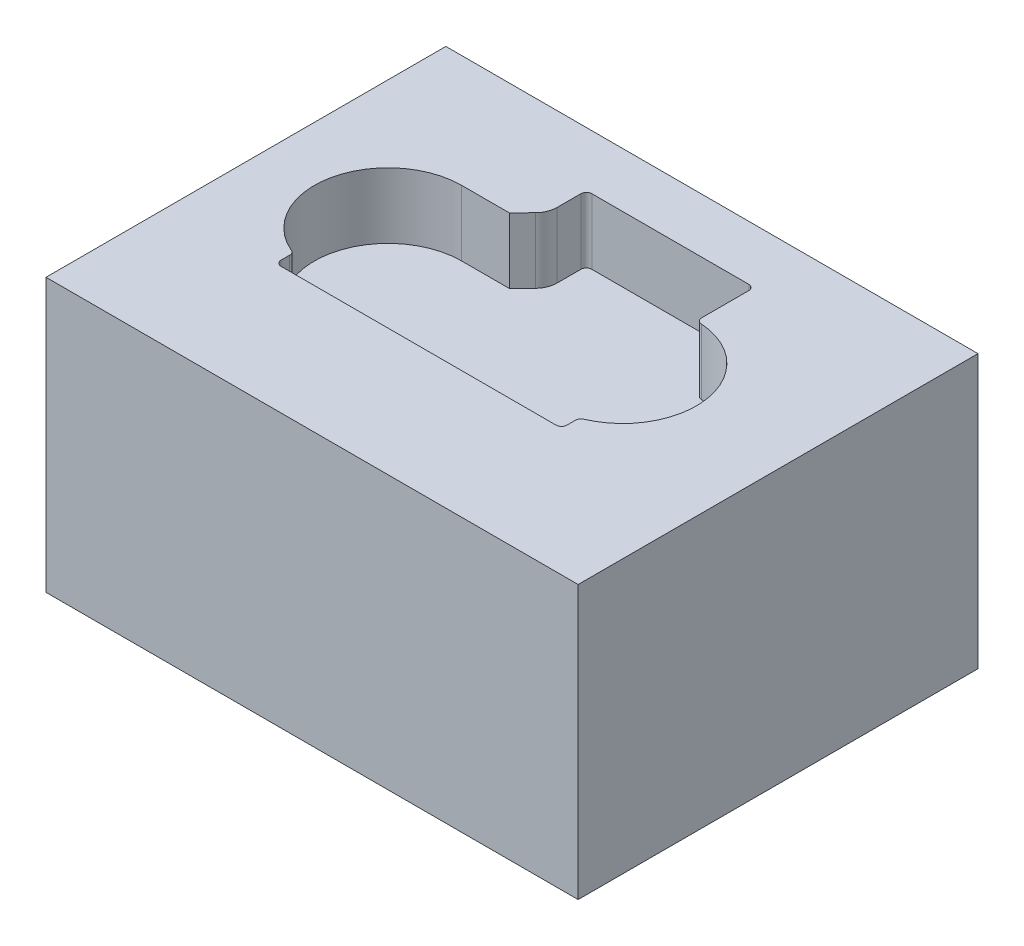
ISO-10303-21;
HEADER;
FILE_DESCRIPTION(('STEP AP214'),'2;1');
FILE_NAME('part.step','',(''),(''),'','','');
FILE_SCHEMA(('AUTOMOTIVE_DESIGN { 1 0 10303 214 1 1 1 1 }'));
ENDSEC;
DATA;
#1=APPLICATION_CONTEXT('core data for automotive mechanical design processes');
#2=APPLICATION_PROTOCOL_DEFINITION('international standard','automotive_design',2000,#1);
#3=PRODUCT_CONTEXT('',#1,'mechanical');
#4=PRODUCT('Part','Part','',(#3));
#5=PRODUCT_RELATED_PRODUCT_CATEGORY('part','',(#4));
#6=PRODUCT_DEFINITION_FORMATION('','',#4);
#7=PRODUCT_DEFINITION_CONTEXT('part definition',#1,'design');
#8=PRODUCT_DEFINITION('design','',#6,#7);
#9=PRODUCT_DEFINITION_SHAPE('','',#8);
#10=(LENGTH_UNIT() NAMED_UNIT(*) SI_UNIT(.MILLI.,.METRE.));
#11=(NAMED_UNIT(*) PLANE_ANGLE_UNIT() SI_UNIT($,.RADIAN.));
#12=(NAMED_UNIT(*) SI_UNIT($,.STERADIAN.) SOLID_ANGLE_UNIT());
#13=UNCERTAINTY_MEASURE_WITH_UNIT(LENGTH_MEASURE(1.E-05),#10,'distance_accuracy_value','');
#14=(GEOMETRIC_REPRESENTATION_CONTEXT(3) GLOBAL_UNCERTAINTY_ASSIGNED_CONTEXT((#13)) GLOBAL_UNIT_ASSIGNED_CONTEXT((#10,
#11,#12)) REPRESENTATION_CONTEXT('',''));
#15=CARTESIAN_POINT('',(0.,0.,0.));
#16=DIRECTION('',(0.,0.,1.));
#17=DIRECTION('',(1.,0.,0.));
#18=AXIS2_PLACEMENT_3D('',#15,#16,#17);
#19=CARTESIAN_POINT('',(0.,25.,0.));
#20=DIRECTION('',(0.,1.,0.));
#21=DIRECTION('',(0.,0.,1.));
#22=AXIS2_PLACEMENT_3D('',#19,#20,#21);
#23=PLANE('',#22);
#24=DIRECTION('',(0.,0.,-1.));
#25=VECTOR('',#24,1.);
#26=CARTESIAN_POINT('',(-101.75,25.,2.66427341404739E-13));
#27=LINE('',#26,#25);
#28=CARTESIAN_POINT('',(-101.75,25.,-180.182738070745));
#29=VERTEX_POINT('',#28);
#30=CARTESIAN_POINT('',(-101.75,25.,-184.5));
#31=VERTEX_POINT('',#30);
#32=EDGE_CURVE('E244',#29,#31,#27,.T.);
#33=ORIENTED_EDGE('',*,*,#32,.F.);
#34=CARTESIAN_POINT('',(-101.25,25.,-180.182738070745));
#35=DIRECTION('',(0.,1.,0.));
#36=DIRECTION('',(0.,0.,1.));
#37=AXIS2_PLACEMENT_3D('',#34,#35,#36);
#38=CIRCLE('',#37,0.5);
#39=CARTESIAN_POINT('',(-101.284482758621,25.,-179.683928548624));
#40=VERTEX_POINT('',#39);
#41=EDGE_CURVE('E308',#29,#40,#38,.T.);
#42=ORIENTED_EDGE('',*,*,#41,.T.);
#43=CARTESIAN_POINT('',(-101.75,25.,-172.95));
#44=DIRECTION('',(0.,1.,0.));
#45=DIRECTION('',(0.,0.,1.));
#46=AXIS2_PLACEMENT_3D('',#43,#44,#45);
#47=CIRCLE('',#46,6.74999999999998);
#48=CARTESIAN_POINT('',(-99.1022841051659,25.,-166.740966215244));
#49=VERTEX_POINT('',#48);
#50=EDGE_CURVE('E214',#40,#49,#47,.F.);
#51=ORIENTED_EDGE('',*,*,#50,.T.);
#52=CARTESIAN_POINT('',(-98.9061570018448,25.,-166.281037786743));
#53=DIRECTION('',(0.,1.,0.));
#54=DIRECTION('',(0.,0.,1.));
#55=AXIS2_PLACEMENT_3D('',#52,#53,#54);
#56=CIRCLE('',#55,0.5);
#57=CARTESIAN_POINT('',(-99.4061570018448,25.,-166.281037786743));
#58=VERTEX_POINT('',#57);
#59=EDGE_CURVE('E298',#49,#58,#56,.T.);
#60=ORIENTED_EDGE('',*,*,#59,.T.);
#61=DIRECTION('',(0.,0.,1.));
#62=VECTOR('',#61,1.);
#63=CARTESIAN_POINT('',(-99.4061570018448,25.,0.));
#64=LINE('',#63,#62);
#65=CARTESIAN_POINT('',(-99.4061570018448,25.,-165.5));
#66=VERTEX_POINT('',#65);
#67=EDGE_CURVE('E218',#58,#66,#64,.T.);
#68=ORIENTED_EDGE('',*,*,#67,.T.);
#69=CARTESIAN_POINT('',(-99.9061570018448,25.,-165.5));
#70=DIRECTION('',(0.,1.,0.));
#71=DIRECTION('',(0.,0.,1.));
#72=AXIS2_PLACEMENT_3D('',#69,#70,#71);
#73=CIRCLE('',#72,0.5);
#74=CARTESIAN_POINT('',(-99.9061570018448,25.,-165.));
#75=VERTEX_POINT('',#74);
#76=EDGE_CURVE('E11',#66,#75,#73,.F.);
#77=ORIENTED_EDGE('',*,*,#76,.T.);
#78=DIRECTION('',(1.,0.,0.));
#79=VECTOR('',#78,1.);
#80=CARTESIAN_POINT('',(0.,25.,-165.));
#81=LINE('',#80,#79);
#82=CARTESIAN_POINT('',(-125.093842998155,25.,-165.));
#83=VERTEX_POINT('',#82);
#84=EDGE_CURVE('E262',#83,#75,#81,.T.);
#85=ORIENTED_EDGE('',*,*,#84,.F.);
#86=CARTESIAN_POINT('',(-125.093842998155,25.,-165.5));
#87=DIRECTION('',(0.,1.,0.));
#88=DIRECTION('',(0.,0.,1.));
#89=AXIS2_PLACEMENT_3D('',#86,#87,#88);
#90=CIRCLE('',#89,0.5);
#91=CARTESIAN_POINT('',(-125.593842998155,25.,-165.5));
#92=VERTEX_POINT('',#91);
#93=EDGE_CURVE('E41',#83,#92,#90,.F.);
#94=ORIENTED_EDGE('',*,*,#93,.T.);
#95=DIRECTION('',(0.,0.,1.));
#96=VECTOR('',#95,1.);
#97=CARTESIAN_POINT('',(-125.593842998155,25.,0.));
#98=LINE('',#97,#96);
#99=CARTESIAN_POINT('',(-125.593842998155,25.,-166.281037786743));
#100=VERTEX_POINT('',#99);
#101=EDGE_CURVE('E259',#100,#92,#98,.T.);
#102=ORIENTED_EDGE('',*,*,#101,.F.);
#103=CARTESIAN_POINT('',(-126.093842998155,25.,-166.281037786743));
#104=DIRECTION('',(0.,1.,0.));
#105=DIRECTION('',(0.,0.,1.));
#106=AXIS2_PLACEMENT_3D('',#103,#104,#105);
#107=CIRCLE('',#106,0.5);
#108=CARTESIAN_POINT('',(-125.897715894834,25.,-166.740966215244));
#109=VERTEX_POINT('',#108);
#110=EDGE_CURVE('E289',#100,#109,#107,.T.);
#111=ORIENTED_EDGE('',*,*,#110,.T.);
#112=CARTESIAN_POINT('',(-123.25,25.,-172.95));
#113=DIRECTION('',(0.,1.,0.));
#114=DIRECTION('',(0.,0.,1.));
#115=AXIS2_PLACEMENT_3D('',#112,#113,#114);
#116=CIRCLE('',#115,6.74999999999999);
#117=CARTESIAN_POINT('',(-123.25,25.,-179.7));
#118=VERTEX_POINT('',#117);
#119=EDGE_CURVE('E256',#118,#109,#116,.T.);
#120=ORIENTED_EDGE('',*,*,#119,.F.);
#121=DIRECTION('',(1.,0.,0.));
#122=VECTOR('',#121,1.);
#123=CARTESIAN_POINT('',(-2.28233147419287E-12,25.,-179.700000000001));
#124=LINE('',#123,#122);
#125=CARTESIAN_POINT('',(-118.879314151318,25.,-179.7));
#126=VERTEX_POINT('',#125);
#127=EDGE_CURVE('E253',#118,#126,#124,.T.);
#128=ORIENTED_EDGE('',*,*,#127,.T.);
#129=DIRECTION('',(-0.696937908891496,0.,0.717131474103562));
#130=VECTOR('',#129,1.);
#131=CARTESIAN_POINT('',(-150.950323524299,25.,-146.699742826135));
#132=LINE('',#131,#130);
#133=CARTESIAN_POINT('',(-117.695737051793,25.,-180.917870888165));
#134=VERTEX_POINT('',#133);
#135=EDGE_CURVE('E251',#134,#126,#132,.T.);
#136=ORIENTED_EDGE('',*,*,#135,.F.);
#137=CARTESIAN_POINT('',(-119.13,25.,-182.311746705948));
#138=DIRECTION('',(0.,1.,0.));
#139=DIRECTION('',(0.,0.,1.));
#140=AXIS2_PLACEMENT_3D('',#137,#138,#139);
#141=CIRCLE('',#140,2.);
#142=CARTESIAN_POINT('',(-117.13,25.,-182.311746705948));
#143=VERTEX_POINT('',#142);
#144=EDGE_CURVE('E278',#134,#143,#141,.T.);
#145=ORIENTED_EDGE('',*,*,#144,.T.);
#146=DIRECTION('',(0.,0.,1.));
#147=VECTOR('',#146,1.);
#148=CARTESIAN_POINT('',(-117.13,25.,0.));
#149=LINE('',#148,#147);
#150=CARTESIAN_POINT('',(-117.13,25.,-184.5));
#151=VERTEX_POINT('',#150);
#152=EDGE_CURVE('E249',#151,#143,#149,.T.);
#153=ORIENTED_EDGE('',*,*,#152,.F.);
#154=CARTESIAN_POINT('',(-116.63,25.,-184.5));
#155=DIRECTION('',(0.,1.,0.));
#156=DIRECTION('',(0.,0.,1.));
#157=AXIS2_PLACEMENT_3D('',#154,#155,#156);
#158=CIRCLE('',#157,0.5);
#159=CARTESIAN_POINT('',(-116.63,25.,-185.));
#160=VERTEX_POINT('',#159);
#161=EDGE_CURVE('E331',#151,#160,#158,.F.);
#162=ORIENTED_EDGE('',*,*,#161,.T.);
#163=DIRECTION('',(1.,0.,0.));
#164=VECTOR('',#163,1.);
#165=CARTESIAN_POINT('',(0.,25.,-185.));
#166=LINE('',#165,#164);
#167=CARTESIAN_POINT('',(-102.25,25.,-185.));
#168=VERTEX_POINT('',#167);
#169=EDGE_CURVE('E247',#160,#168,#166,.T.);
#170=ORIENTED_EDGE('',*,*,#169,.T.);
#171=CARTESIAN_POINT('',(-102.25,25.,-184.5));
#172=DIRECTION('',(0.,1.,0.));
#173=DIRECTION('',(0.,0.,1.));
#174=AXIS2_PLACEMENT_3D('',#171,#172,#173);
#175=CIRCLE('',#174,0.5);
#176=EDGE_CURVE('E322',#168,#31,#175,.F.);
#177=ORIENTED_EDGE('',*,*,#176,.T.);
#178=EDGE_LOOP('',(#33,#42,#51,#60,#68,#77,#85,#94,#102,#111,#120,#128,#136,#145,#153,#162,#170,#177));
#179=FACE_BOUND('',#178,.T.);
#180=DIRECTION('',(1.,0.,0.));
#181=VECTOR('',#180,1.);
#182=CARTESIAN_POINT('',(0.,25.,-153.367271313336));
#183=LINE('',#182,#181);
#184=CARTESIAN_POINT('',(-135.,25.,-153.367271313336));
#185=VERTEX_POINT('',#184);
#186=CARTESIAN_POINT('',(-86.2505292392282,25.,-153.367271313336));
#187=VERTEX_POINT('',#186);
#188=EDGE_CURVE('E211',#185,#187,#183,.T.);
#189=ORIENTED_EDGE('',*,*,#188,.T.);
#190=DIRECTION('',(0.,0.,-1.));
#191=VECTOR('',#190,1.);
#192=CARTESIAN_POINT('',(-86.2505292392282,25.,0.));
#193=LINE('',#192,#191);
#194=CARTESIAN_POINT('',(-86.2505292392282,25.,-190.));
#195=VERTEX_POINT('',#194);
#196=EDGE_CURVE('E207',#187,#195,#193,.T.);
#197=ORIENTED_EDGE('',*,*,#196,.T.);
#198=DIRECTION('',(-1.,0.,0.));
#199=VECTOR('',#198,1.);
#200=CARTESIAN_POINT('',(135.,25.,-190.));
#201=LINE('',#200,#199);
#202=CARTESIAN_POINT('',(-135.,25.,-190.));
#203=VERTEX_POINT('',#202);
#204=EDGE_CURVE('E189',#195,#203,#201,.T.);
#205=ORIENTED_EDGE('',*,*,#204,.T.);
#206=DIRECTION('',(0.,0.,1.));
#207=VECTOR('',#206,1.);
#208=CARTESIAN_POINT('',(-135.,25.,-190.));
#209=LINE('',#208,#207);
#210=EDGE_CURVE('E272',#203,#185,#209,.T.);
#211=ORIENTED_EDGE('',*,*,#210,.T.);
#212=EDGE_LOOP('',(#189,#197,#205,#211));
#213=FACE_BOUND('',#212,.T.);
#214=ADVANCED_FACE('F33',(#179,#213),#23,.T.);
#215=CARTESIAN_POINT('',(-101.75,19.,-172.95));
#216=DIRECTION('',(0.,1.,0.));
#217=DIRECTION('',(0.,0.,1.));
#218=AXIS2_PLACEMENT_3D('',#215,#216,#217);
#219=CYLINDRICAL_SURFACE('',#218,6.74999999999998);
#220=ORIENTED_EDGE('',*,*,#50,.F.);
#221=DIRECTION('',(0.,1.,0.));
#222=VECTOR('',#221,1.);
#223=CARTESIAN_POINT('',(-101.284482758621,19.,-179.683928548624));
#224=LINE('',#223,#222);
#225=CARTESIAN_POINT('',(-101.284482758621,19.,-179.683928548624));
#226=VERTEX_POINT('',#225);
#227=EDGE_CURVE('E310',#40,#226,#224,.F.);
#228=ORIENTED_EDGE('',*,*,#227,.T.);
#229=CARTESIAN_POINT('',(-101.75,19.,-172.95));
#230=DIRECTION('',(0.,1.,0.));
#231=DIRECTION('',(0.,0.,1.));
#232=AXIS2_PLACEMENT_3D('',#229,#230,#231);
#233=CIRCLE('',#232,6.74999999999998);
#234=CARTESIAN_POINT('',(-99.1022841051659,19.,-166.740966215244));
#235=VERTEX_POINT('',#234);
#236=EDGE_CURVE('E215',#226,#235,#233,.F.);
#237=ORIENTED_EDGE('',*,*,#236,.T.);
#238=DIRECTION('',(0.,1.,0.));
#239=VECTOR('',#238,1.);
#240=CARTESIAN_POINT('',(-99.1022841051659,19.,-166.740966215244));
#241=LINE('',#240,#239);
#242=EDGE_CURVE('E295',#235,#49,#241,.T.);
#243=ORIENTED_EDGE('',*,*,#242,.T.);
#244=EDGE_LOOP('',(#220,#228,#237,#243));
#245=FACE_BOUND('',#244,.T.);
#246=ADVANCED_FACE('F440',(#245),#219,.F.);
#247=CARTESIAN_POINT('',(-99.4061570018448,19.,0.));
#248=DIRECTION('',(-1.,0.,0.));
#249=DIRECTION('',(0.,0.,1.));
#250=AXIS2_PLACEMENT_3D('',#247,#248,#249);
#251=PLANE('',#250);
#252=DIRECTION('',(0.,0.,1.));
#253=VECTOR('',#252,1.);
#254=CARTESIAN_POINT('',(-99.4061570018448,19.,0.));
#255=LINE('',#254,#253);
#256=CARTESIAN_POINT('',(-99.4061570018448,19.,-166.281037786743));
#257=VERTEX_POINT('',#256);
#258=CARTESIAN_POINT('',(-99.4061570018448,19.,-165.5));
#259=VERTEX_POINT('',#258);
#260=EDGE_CURVE('E239',#257,#259,#255,.T.);
#261=ORIENTED_EDGE('',*,*,#260,.T.);
#262=DIRECTION('',(0.,1.,0.));
#263=VECTOR('',#262,1.);
#264=CARTESIAN_POINT('',(-99.4061570018448,19.,-165.5));
#265=LINE('',#264,#263);
#266=EDGE_CURVE('E344',#259,#66,#265,.T.);
#267=ORIENTED_EDGE('',*,*,#266,.T.);
#268=ORIENTED_EDGE('',*,*,#67,.F.);
#269=DIRECTION('',(0.,1.,0.));
#270=VECTOR('',#269,1.);
#271=CARTESIAN_POINT('',(-99.4061570018448,19.,-166.281037786743));
#272=LINE('',#271,#270);
#273=EDGE_CURVE('E300',#58,#257,#272,.F.);
#274=ORIENTED_EDGE('',*,*,#273,.T.);
#275=EDGE_LOOP('',(#261,#267,#268,#274));
#276=FACE_BOUND('',#275,.T.);
#277=ADVANCED_FACE('F372',(#276),#251,.T.);
#278=CARTESIAN_POINT('',(0.,19.,-165.));
#279=DIRECTION('',(0.,0.,1.));
#280=DIRECTION('',(1.,0.,0.));
#281=AXIS2_PLACEMENT_3D('',#278,#279,#280);
#282=PLANE('',#281);
#283=DIRECTION('',(1.,0.,0.));
#284=VECTOR('',#283,1.);
#285=CARTESIAN_POINT('',(0.,19.,-165.));
#286=LINE('',#285,#284);
#287=CARTESIAN_POINT('',(-125.093842998155,19.,-165.));
#288=VERTEX_POINT('',#287);
#289=CARTESIAN_POINT('',(-99.9061570018448,19.,-165.));
#290=VERTEX_POINT('',#289);
#291=EDGE_CURVE('E236',#288,#290,#286,.T.);
#292=ORIENTED_EDGE('',*,*,#291,.F.);
#293=DIRECTION('',(0.,1.,0.));
#294=VECTOR('',#293,1.);
#295=CARTESIAN_POINT('',(-125.093842998155,25.,-165.));
#296=LINE('',#295,#294);
#297=EDGE_CURVE('E335',#288,#83,#296,.T.);
#298=ORIENTED_EDGE('',*,*,#297,.T.);
#299=ORIENTED_EDGE('',*,*,#84,.T.);
#300=DIRECTION('',(0.,1.,0.));
#301=VECTOR('',#300,1.);
#302=CARTESIAN_POINT('',(-99.9061570018448,19.,-165.));
#303=LINE('',#302,#301);
#304=EDGE_CURVE('E333',#75,#290,#303,.F.);
#305=ORIENTED_EDGE('',*,*,#304,.T.);
#306=EDGE_LOOP('',(#292,#298,#299,#305));
#307=FACE_BOUND('',#306,.T.);
#308=ADVANCED_FACE('F365',(#307),#282,.F.);
#309=CARTESIAN_POINT('',(-125.593842998155,19.,0.));
#310=DIRECTION('',(-1.,0.,0.));
#311=DIRECTION('',(0.,0.,1.));
#312=AXIS2_PLACEMENT_3D('',#309,#310,#311);
#313=PLANE('',#312);
#314=ORIENTED_EDGE('',*,*,#101,.T.);
#315=DIRECTION('',(0.,1.,0.));
#316=VECTOR('',#315,1.);
#317=CARTESIAN_POINT('',(-125.593842998155,19.,-165.5));
#318=LINE('',#317,#316);
#319=CARTESIAN_POINT('',(-125.593842998155,19.,-165.5));
#320=VERTEX_POINT('',#319);
#321=EDGE_CURVE('E338',#92,#320,#318,.F.);
#322=ORIENTED_EDGE('',*,*,#321,.T.);
#323=DIRECTION('',(0.,0.,1.));
#324=VECTOR('',#323,1.);
#325=CARTESIAN_POINT('',(-125.593842998155,19.,0.));
#326=LINE('',#325,#324);
#327=CARTESIAN_POINT('',(-125.593842998155,19.,-166.281037786743));
#328=VERTEX_POINT('',#327);
#329=EDGE_CURVE('E233',#328,#320,#326,.T.);
#330=ORIENTED_EDGE('',*,*,#329,.F.);
#331=DIRECTION('',(0.,1.,0.));
#332=VECTOR('',#331,1.);
#333=CARTESIAN_POINT('',(-125.593842998155,19.,-166.281037786743));
#334=LINE('',#333,#332);
#335=EDGE_CURVE('E286',#328,#100,#334,.T.);
#336=ORIENTED_EDGE('',*,*,#335,.T.);
#337=EDGE_LOOP('',(#314,#322,#330,#336));
#338=FACE_BOUND('',#337,.T.);
#339=ADVANCED_FACE('F355',(#338),#313,.F.);
#340=CARTESIAN_POINT('',(-123.25,19.,-172.95));
#341=DIRECTION('',(0.,1.,0.));
#342=DIRECTION('',(0.,0.,1.));
#343=AXIS2_PLACEMENT_3D('',#340,#341,#342);
#344=CYLINDRICAL_SURFACE('',#343,6.74999999999999);
#345=ORIENTED_EDGE('',*,*,#119,.T.);
#346=DIRECTION('',(0.,1.,0.));
#347=VECTOR('',#346,1.);
#348=CARTESIAN_POINT('',(-125.897715894834,19.,-166.740966215244));
#349=LINE('',#348,#347);
#350=CARTESIAN_POINT('',(-125.897715894834,19.,-166.740966215244));
#351=VERTEX_POINT('',#350);
#352=EDGE_CURVE('E291',#109,#351,#349,.F.);
#353=ORIENTED_EDGE('',*,*,#352,.T.);
#354=CARTESIAN_POINT('',(-123.25,19.,-172.95));
#355=DIRECTION('',(0.,1.,0.));
#356=DIRECTION('',(0.,0.,1.));
#357=AXIS2_PLACEMENT_3D('',#354,#355,#356);
#358=CIRCLE('',#357,6.74999999999999);
#359=CARTESIAN_POINT('',(-123.25,19.,-179.7));
#360=VERTEX_POINT('',#359);
#361=EDGE_CURVE('E230',#360,#351,#358,.T.);
#362=ORIENTED_EDGE('',*,*,#361,.F.);
#363=DIRECTION('',(0.,1.,0.));
#364=VECTOR('',#363,1.);
#365=CARTESIAN_POINT('',(-123.25,19.,-179.7));
#366=LINE('',#365,#364);
#367=EDGE_CURVE('E267',#360,#118,#366,.T.);
#368=ORIENTED_EDGE('',*,*,#367,.T.);
#369=EDGE_LOOP('',(#345,#353,#362,#368));
#370=FACE_BOUND('',#369,.T.);
#371=ADVANCED_FACE('F426',(#370),#344,.F.);
#372=CARTESIAN_POINT('',(-2.28233147419287E-12,19.,-179.700000000001));
#373=DIRECTION('',(0.,0.,1.));
#374=DIRECTION('',(1.,0.,0.));
#375=AXIS2_PLACEMENT_3D('',#372,#373,#374);
#376=PLANE('',#375);
#377=ORIENTED_EDGE('',*,*,#127,.F.);
#378=ORIENTED_EDGE('',*,*,#367,.F.);
#379=DIRECTION('',(1.,0.,0.));
#380=VECTOR('',#379,1.);
#381=CARTESIAN_POINT('',(-2.28233147419287E-12,19.,-179.700000000001));
#382=LINE('',#381,#380);
#383=CARTESIAN_POINT('',(-118.879314151318,19.,-179.7));
#384=VERTEX_POINT('',#383);
#385=EDGE_CURVE('E227',#360,#384,#382,.T.);
#386=ORIENTED_EDGE('',*,*,#385,.T.);
#387=DIRECTION('',(0.,1.,0.));
#388=VECTOR('',#387,1.);
#389=CARTESIAN_POINT('',(-118.879314151318,19.,-179.7));
#390=LINE('',#389,#388);
#391=EDGE_CURVE('E242',#384,#126,#390,.T.);
#392=ORIENTED_EDGE('',*,*,#391,.T.);
#393=EDGE_LOOP('',(#377,#378,#386,#392));
#394=FACE_BOUND('',#393,.T.);
#395=ADVANCED_FACE('F422',(#394),#376,.T.);
#396=CARTESIAN_POINT('',(-150.950323524299,19.,-146.699742826135));
#397=DIRECTION('',(-0.717131474103562,0.,-0.696937908891496));
#398=DIRECTION('',(-0.696937908891496,0.,0.717131474103562));
#399=AXIS2_PLACEMENT_3D('',#396,#397,#398);
#400=PLANE('',#399);
#401=DIRECTION('',(-0.696937908891496,0.,0.717131474103562));
#402=VECTOR('',#401,1.);
#403=CARTESIAN_POINT('',(-150.950323524299,19.,-146.699742826135));
#404=LINE('',#403,#402);
#405=CARTESIAN_POINT('',(-117.695737051793,19.,-180.917870888165));
#406=VERTEX_POINT('',#405);
#407=EDGE_CURVE('E225',#406,#384,#404,.T.);
#408=ORIENTED_EDGE('',*,*,#407,.F.);
#409=DIRECTION('',(0.,1.,0.));
#410=VECTOR('',#409,1.);
#411=CARTESIAN_POINT('',(-117.695737051793,19.,-180.917870888165));
#412=LINE('',#411,#410);
#413=EDGE_CURVE('E275',#406,#134,#412,.T.);
#414=ORIENTED_EDGE('',*,*,#413,.T.);
#415=ORIENTED_EDGE('',*,*,#135,.T.);
#416=ORIENTED_EDGE('',*,*,#391,.F.);
#417=EDGE_LOOP('',(#408,#414,#415,#416));
#418=FACE_BOUND('',#417,.T.);
#419=ADVANCED_FACE('F419',(#418),#400,.F.);
#420=CARTESIAN_POINT('',(-117.13,19.,0.));
#421=DIRECTION('',(-1.,0.,0.));
#422=DIRECTION('',(0.,0.,1.));
#423=AXIS2_PLACEMENT_3D('',#420,#421,#422);
#424=PLANE('',#423);
#425=DIRECTION('',(0.,0.,1.));
#426=VECTOR('',#425,1.);
#427=CARTESIAN_POINT('',(-117.13,19.,0.));
#428=LINE('',#427,#426);
#429=CARTESIAN_POINT('',(-117.13,19.,-184.5));
#430=VERTEX_POINT('',#429);
#431=CARTESIAN_POINT('',(-117.13,19.,-182.311746705948));
#432=VERTEX_POINT('',#431);
#433=EDGE_CURVE('E223',#430,#432,#428,.T.);
#434=ORIENTED_EDGE('',*,*,#433,.F.);
#435=DIRECTION('',(0.,1.,0.));
#436=VECTOR('',#435,1.);
#437=CARTESIAN_POINT('',(-117.13,19.,-184.5));
#438=LINE('',#437,#436);
#439=EDGE_CURVE('E324',#430,#151,#438,.T.);
#440=ORIENTED_EDGE('',*,*,#439,.T.);
#441=ORIENTED_EDGE('',*,*,#152,.T.);
#442=DIRECTION('',(0.,1.,0.));
#443=VECTOR('',#442,1.);
#444=CARTESIAN_POINT('',(-117.13,19.,-182.311746705948));
#445=LINE('',#444,#443);
#446=EDGE_CURVE('E281',#143,#432,#445,.F.);
#447=ORIENTED_EDGE('',*,*,#446,.T.);
#448=EDGE_LOOP('',(#434,#440,#441,#447));
#449=FACE_BOUND('',#448,.T.);
#450=ADVANCED_FACE('F408',(#449),#424,.F.);
#451=CARTESIAN_POINT('',(0.,19.,-185.));
#452=DIRECTION('',(0.,0.,1.));
#453=DIRECTION('',(1.,0.,0.));
#454=AXIS2_PLACEMENT_3D('',#451,#452,#453);
#455=PLANE('',#454);
#456=ORIENTED_EDGE('',*,*,#169,.F.);
#457=DIRECTION('',(0.,1.,0.));
#458=VECTOR('',#457,1.);
#459=CARTESIAN_POINT('',(-116.63,19.,-185.));
#460=LINE('',#459,#458);
#461=CARTESIAN_POINT('',(-116.63,19.,-185.));
#462=VERTEX_POINT('',#461);
#463=EDGE_CURVE('E327',#160,#462,#460,.F.);
#464=ORIENTED_EDGE('',*,*,#463,.T.);
#465=DIRECTION('',(1.,0.,0.));
#466=VECTOR('',#465,1.);
#467=CARTESIAN_POINT('',(0.,19.,-185.));
#468=LINE('',#467,#466);
#469=CARTESIAN_POINT('',(-102.25,19.,-185.));
#470=VERTEX_POINT('',#469);
#471=EDGE_CURVE('E221',#462,#470,#468,.T.);
#472=ORIENTED_EDGE('',*,*,#471,.T.);
#473=DIRECTION('',(0.,1.,0.));
#474=VECTOR('',#473,1.);
#475=CARTESIAN_POINT('',(-102.25,19.,-185.));
#476=LINE('',#475,#474);
#477=EDGE_CURVE('E314',#470,#168,#476,.T.);
#478=ORIENTED_EDGE('',*,*,#477,.T.);
#479=EDGE_LOOP('',(#456,#464,#472,#478));
#480=FACE_BOUND('',#479,.T.);
#481=ADVANCED_FACE('F398',(#480),#455,.T.);
#482=CARTESIAN_POINT('',(-101.75,19.,2.66427341404739E-13));
#483=DIRECTION('',(1.,0.,0.));
#484=DIRECTION('',(0.,0.,-1.));
#485=AXIS2_PLACEMENT_3D('',#482,#483,#484);
#486=PLANE('',#485);
#487=ORIENTED_EDGE('',*,*,#32,.T.);
#488=DIRECTION('',(0.,1.,0.));
#489=VECTOR('',#488,1.);
#490=CARTESIAN_POINT('',(-101.75,19.,-184.5));
#491=LINE('',#490,#489);
#492=CARTESIAN_POINT('',(-101.75,19.,-184.5));
#493=VERTEX_POINT('',#492);
#494=EDGE_CURVE('E317',#31,#493,#491,.F.);
#495=ORIENTED_EDGE('',*,*,#494,.T.);
#496=DIRECTION('',(0.,0.,-1.));
#497=VECTOR('',#496,1.);
#498=CARTESIAN_POINT('',(-101.75,19.,2.66427341404739E-13));
#499=LINE('',#498,#497);
#500=CARTESIAN_POINT('',(-101.75,19.,-180.182738070745));
#501=VERTEX_POINT('',#500);
#502=EDGE_CURVE('E217',#501,#493,#499,.T.);
#503=ORIENTED_EDGE('',*,*,#502,.F.);
#504=DIRECTION('',(0.,-1.,0.));
#505=VECTOR('',#504,1.);
#506=CARTESIAN_POINT('',(-101.75,25.,-180.182738070745));
#507=LINE('',#506,#505);
#508=EDGE_CURVE('E305',#501,#29,#507,.F.);
#509=ORIENTED_EDGE('',*,*,#508,.T.);
#510=EDGE_LOOP('',(#487,#495,#503,#509));
#511=FACE_BOUND('',#510,.T.);
#512=ADVANCED_FACE('F388',(#511),#486,.F.);
#513=CARTESIAN_POINT('',(0.,19.,0.));
#514=DIRECTION('',(0.,1.,0.));
#515=DIRECTION('',(0.,0.,1.));
#516=AXIS2_PLACEMENT_3D('',#513,#514,#515);
#517=PLANE('',#516);
#518=ORIENTED_EDGE('',*,*,#329,.T.);
#519=CARTESIAN_POINT('',(-125.093842998155,19.,-165.5));
#520=DIRECTION('',(0.,1.,0.));
#521=DIRECTION('',(0.,0.,1.));
#522=AXIS2_PLACEMENT_3D('',#519,#520,#521);
#523=CIRCLE('',#522,0.5);
#524=EDGE_CURVE('E342',#320,#288,#523,.T.);
#525=ORIENTED_EDGE('',*,*,#524,.T.);
#526=ORIENTED_EDGE('',*,*,#291,.T.);
#527=CARTESIAN_POINT('',(-99.9061570018448,19.,-165.5));
#528=DIRECTION('',(0.,1.,0.));
#529=DIRECTION('',(0.,0.,1.));
#530=AXIS2_PLACEMENT_3D('',#527,#528,#529);
#531=CIRCLE('',#530,0.5);
#532=EDGE_CURVE('E340',#290,#259,#531,.T.);
#533=ORIENTED_EDGE('',*,*,#532,.T.);
#534=ORIENTED_EDGE('',*,*,#260,.F.);
#535=CARTESIAN_POINT('',(-98.9061570018448,19.,-166.281037786743));
#536=DIRECTION('',(0.,1.,0.));
#537=DIRECTION('',(0.,0.,1.));
#538=AXIS2_PLACEMENT_3D('',#535,#536,#537);
#539=CIRCLE('',#538,0.5);
#540=EDGE_CURVE('E302',#257,#235,#539,.F.);
#541=ORIENTED_EDGE('',*,*,#540,.T.);
#542=ORIENTED_EDGE('',*,*,#236,.F.);
#543=CARTESIAN_POINT('',(-101.25,19.,-180.182738070745));
#544=DIRECTION('',(0.,1.,0.));
#545=DIRECTION('',(0.,0.,1.));
#546=AXIS2_PLACEMENT_3D('',#543,#544,#545);
#547=CIRCLE('',#546,0.5);
#548=EDGE_CURVE('E312',#226,#501,#547,.F.);
#549=ORIENTED_EDGE('',*,*,#548,.T.);
#550=ORIENTED_EDGE('',*,*,#502,.T.);
#551=CARTESIAN_POINT('',(-102.25,19.,-184.5));
#552=DIRECTION('',(0.,1.,0.));
#553=DIRECTION('',(0.,0.,1.));
#554=AXIS2_PLACEMENT_3D('',#551,#552,#553);
#555=CIRCLE('',#554,0.5);
#556=EDGE_CURVE('E319',#493,#470,#555,.T.);
#557=ORIENTED_EDGE('',*,*,#556,.T.);
#558=ORIENTED_EDGE('',*,*,#471,.F.);
#559=CARTESIAN_POINT('',(-116.63,19.,-184.5));
#560=DIRECTION('',(0.,1.,0.));
#561=DIRECTION('',(0.,0.,1.));
#562=AXIS2_PLACEMENT_3D('',#559,#560,#561);
#563=CIRCLE('',#562,0.5);
#564=EDGE_CURVE('E329',#462,#430,#563,.T.);
#565=ORIENTED_EDGE('',*,*,#564,.T.);
#566=ORIENTED_EDGE('',*,*,#433,.T.);
#567=CARTESIAN_POINT('',(-119.13,19.,-182.311746705948));
#568=DIRECTION('',(0.,1.,0.));
#569=DIRECTION('',(0.,0.,1.));
#570=AXIS2_PLACEMENT_3D('',#567,#568,#569);
#571=CIRCLE('',#570,2.);
#572=EDGE_CURVE('E284',#432,#406,#571,.F.);
#573=ORIENTED_EDGE('',*,*,#572,.T.);
#574=ORIENTED_EDGE('',*,*,#407,.T.);
#575=ORIENTED_EDGE('',*,*,#385,.F.);
#576=ORIENTED_EDGE('',*,*,#361,.T.);
#577=CARTESIAN_POINT('',(-126.093842998155,19.,-166.281037786743));
#578=DIRECTION('',(0.,1.,0.));
#579=DIRECTION('',(0.,0.,1.));
#580=AXIS2_PLACEMENT_3D('',#577,#578,#579);
#581=CIRCLE('',#580,0.5);
#582=EDGE_CURVE('E293',#351,#328,#581,.F.);
#583=ORIENTED_EDGE('',*,*,#582,.T.);
#584=EDGE_LOOP('',(#518,#525,#526,#533,#534,#541,#542,#549,#550,#557,#558,#565,#566,#573,#574,
#575,#576,#583));
#585=FACE_BOUND('',#584,.T.);
#586=ADVANCED_FACE('F362',(#585),#517,.T.);
#587=CARTESIAN_POINT('',(-119.13,19.,-182.311746705948));
#588=DIRECTION('',(0.,1.,0.));
#589=DIRECTION('',(0.,0.,1.));
#590=AXIS2_PLACEMENT_3D('',#587,#588,#589);
#591=CYLINDRICAL_SURFACE('',#590,2.);
#592=ORIENTED_EDGE('',*,*,#572,.F.);
#593=ORIENTED_EDGE('',*,*,#446,.F.);
#594=ORIENTED_EDGE('',*,*,#144,.F.);
#595=ORIENTED_EDGE('',*,*,#413,.F.);
#596=EDGE_LOOP('',(#592,#593,#594,#595));
#597=FACE_BOUND('',#596,.T.);
#598=ADVANCED_FACE('F414',(#597),#591,.T.);
#599=CARTESIAN_POINT('',(-126.093842998155,19.,-166.281037786743));
#600=DIRECTION('',(0.,1.,0.));
#601=DIRECTION('',(0.,0.,1.));
#602=AXIS2_PLACEMENT_3D('',#599,#600,#601);
#603=CYLINDRICAL_SURFACE('',#602,0.5);
#604=ORIENTED_EDGE('',*,*,#582,.F.);
#605=ORIENTED_EDGE('',*,*,#352,.F.);
#606=ORIENTED_EDGE('',*,*,#110,.F.);
#607=ORIENTED_EDGE('',*,*,#335,.F.);
#608=EDGE_LOOP('',(#604,#605,#606,#607));
#609=FACE_BOUND('',#608,.T.);
#610=ADVANCED_FACE('F430',(#609),#603,.T.);
#611=CARTESIAN_POINT('',(-98.9061570018448,19.,-166.281037786743));
#612=DIRECTION('',(0.,1.,0.));
#613=DIRECTION('',(0.,0.,1.));
#614=AXIS2_PLACEMENT_3D('',#611,#612,#613);
#615=CYLINDRICAL_SURFACE('',#614,0.5);
#616=ORIENTED_EDGE('',*,*,#540,.F.);
#617=ORIENTED_EDGE('',*,*,#273,.F.);
#618=ORIENTED_EDGE('',*,*,#59,.F.);
#619=ORIENTED_EDGE('',*,*,#242,.F.);
#620=EDGE_LOOP('',(#616,#617,#618,#619));
#621=FACE_BOUND('',#620,.T.);
#622=ADVANCED_FACE('F377',(#621),#615,.T.);
#623=CARTESIAN_POINT('',(-101.25,19.,-180.182738070745));
#624=DIRECTION('',(0.,1.,0.));
#625=DIRECTION('',(0.,0.,1.));
#626=AXIS2_PLACEMENT_3D('',#623,#624,#625);
#627=CYLINDRICAL_SURFACE('',#626,0.5);
#628=ORIENTED_EDGE('',*,*,#548,.F.);
#629=ORIENTED_EDGE('',*,*,#227,.F.);
#630=ORIENTED_EDGE('',*,*,#41,.F.);
#631=ORIENTED_EDGE('',*,*,#508,.F.);
#632=EDGE_LOOP('',(#628,#629,#630,#631));
#633=FACE_BOUND('',#632,.T.);
#634=ADVANCED_FACE('F386',(#633),#627,.T.);
#635=CARTESIAN_POINT('',(-102.25,19.,-184.5));
#636=DIRECTION('',(0.,1.,0.));
#637=DIRECTION('',(0.,0.,1.));
#638=AXIS2_PLACEMENT_3D('',#635,#636,#637);
#639=CYLINDRICAL_SURFACE('',#638,0.5);
#640=ORIENTED_EDGE('',*,*,#556,.F.);
#641=ORIENTED_EDGE('',*,*,#494,.F.);
#642=ORIENTED_EDGE('',*,*,#176,.F.);
#643=ORIENTED_EDGE('',*,*,#477,.F.);
#644=EDGE_LOOP('',(#640,#641,#642,#643));
#645=FACE_BOUND('',#644,.T.);
#646=ADVANCED_FACE('F396',(#645),#639,.F.);
#647=CARTESIAN_POINT('',(-116.63,19.,-184.5));
#648=DIRECTION('',(0.,1.,0.));
#649=DIRECTION('',(0.,0.,1.));
#650=AXIS2_PLACEMENT_3D('',#647,#648,#649);
#651=CYLINDRICAL_SURFACE('',#650,0.5);
#652=ORIENTED_EDGE('',*,*,#564,.F.);
#653=ORIENTED_EDGE('',*,*,#463,.F.);
#654=ORIENTED_EDGE('',*,*,#161,.F.);
#655=ORIENTED_EDGE('',*,*,#439,.F.);
#656=EDGE_LOOP('',(#652,#653,#654,#655));
#657=FACE_BOUND('',#656,.T.);
#658=ADVANCED_FACE('F405',(#657),#651,.F.);
#659=CARTESIAN_POINT('',(-125.093842998155,19.,-165.5));
#660=DIRECTION('',(0.,-1.,0.));
#661=DIRECTION('',(0.,0.,-1.));
#662=AXIS2_PLACEMENT_3D('',#659,#660,#661);
#663=CYLINDRICAL_SURFACE('',#662,0.5);
#664=ORIENTED_EDGE('',*,*,#524,.F.);
#665=ORIENTED_EDGE('',*,*,#321,.F.);
#666=ORIENTED_EDGE('',*,*,#93,.F.);
#667=ORIENTED_EDGE('',*,*,#297,.F.);
#668=EDGE_LOOP('',(#664,#665,#666,#667));
#669=FACE_BOUND('',#668,.T.);
#670=ADVANCED_FACE('F359',(#669),#663,.F.);
#671=CARTESIAN_POINT('',(-99.9061570018448,19.,-165.5));
#672=DIRECTION('',(0.,1.,0.));
#673=DIRECTION('',(0.,0.,1.));
#674=AXIS2_PLACEMENT_3D('',#671,#672,#673);
#675=CYLINDRICAL_SURFACE('',#674,0.5);
#676=ORIENTED_EDGE('',*,*,#532,.F.);
#677=ORIENTED_EDGE('',*,*,#304,.F.);
#678=ORIENTED_EDGE('',*,*,#76,.F.);
#679=ORIENTED_EDGE('',*,*,#266,.F.);
#680=EDGE_LOOP('',(#676,#677,#678,#679));
#681=FACE_BOUND('',#680,.T.);
#682=ADVANCED_FACE('F35',(#681),#675,.F.);
#683=CARTESIAN_POINT('',(-135.,0.,-190.));
#684=DIRECTION('',(-1.,0.,0.));
#685=DIRECTION('',(0.,0.,1.));
#686=AXIS2_PLACEMENT_3D('',#683,#684,#685);
#687=PLANE('',#686);
#688=DIRECTION('',(0.,1.,0.));
#689=VECTOR('',#688,1.);
#690=CARTESIAN_POINT('',(-135.,0.,-190.));
#691=LINE('',#690,#689);
#692=CARTESIAN_POINT('',(-135.,0.,-190.));
#693=VERTEX_POINT('',#692);
#694=EDGE_CURVE('E192',#693,#203,#691,.T.);
#695=ORIENTED_EDGE('',*,*,#694,.F.);
#696=DIRECTION('',(0.,0.,1.));
#697=VECTOR('',#696,1.);
#698=CARTESIAN_POINT('',(-135.,0.,-190.));
#699=LINE('',#698,#697);
#700=CARTESIAN_POINT('',(-135.,0.,-153.367271313336));
#701=VERTEX_POINT('',#700);
#702=EDGE_CURVE('E56',#693,#701,#699,.T.);
#703=ORIENTED_EDGE('',*,*,#702,.T.);
#704=DIRECTION('',(0.,1.,0.));
#705=VECTOR('',#704,1.);
#706=CARTESIAN_POINT('',(-135.,0.,-153.367271313336));
#707=LINE('',#706,#705);
#708=EDGE_CURVE('E202',#701,#185,#707,.T.);
#709=ORIENTED_EDGE('',*,*,#708,.T.);
#710=ORIENTED_EDGE('',*,*,#210,.F.);
#711=EDGE_LOOP('',(#695,#703,#709,#710));
#712=FACE_BOUND('',#711,.T.);
#713=ADVANCED_FACE('F462',(#712),#687,.T.);
#714=CARTESIAN_POINT('',(-135.,0.,-190.));
#715=DIRECTION('',(0.,0.,-1.));
#716=DIRECTION('',(-1.,0.,0.));
#717=AXIS2_PLACEMENT_3D('',#714,#715,#716);
#718=PLANE('',#717);
#719=DIRECTION('',(0.,1.,0.));
#720=VECTOR('',#719,1.);
#721=CARTESIAN_POINT('',(-86.2505292392282,0.,-190.));
#722=LINE('',#721,#720);
#723=CARTESIAN_POINT('',(-86.2505292392282,0.,-190.));
#724=VERTEX_POINT('',#723);
#725=EDGE_CURVE('E182',#724,#195,#722,.T.);
#726=ORIENTED_EDGE('',*,*,#725,.F.);
#727=DIRECTION('',(-1.,0.,0.));
#728=VECTOR('',#727,1.);
#729=CARTESIAN_POINT('',(-135.,0.,-190.));
#730=LINE('',#729,#728);
#731=EDGE_CURVE('E187',#724,#693,#730,.T.);
#732=ORIENTED_EDGE('',*,*,#731,.T.);
#733=ORIENTED_EDGE('',*,*,#694,.T.);
#734=ORIENTED_EDGE('',*,*,#204,.F.);
#735=EDGE_LOOP('',(#726,#732,#733,#734));
#736=FACE_BOUND('',#735,.T.);
#737=ADVANCED_FACE('F184',(#736),#718,.T.);
#738=CARTESIAN_POINT('',(-86.2505292392282,0.,-190.));
#739=DIRECTION('',(1.,0.,0.));
#740=DIRECTION('',(0.,0.,-1.));
#741=AXIS2_PLACEMENT_3D('',#738,#739,#740);
#742=PLANE('',#741);
#743=DIRECTION('',(0.,1.,0.));
#744=VECTOR('',#743,1.);
#745=CARTESIAN_POINT('',(-86.2505292392282,0.,-153.367271313336));
#746=LINE('',#745,#744);
#747=CARTESIAN_POINT('',(-86.2505292392282,0.,-153.367271313336));
#748=VERTEX_POINT('',#747);
#749=EDGE_CURVE('E48',#748,#187,#746,.T.);
#750=ORIENTED_EDGE('',*,*,#749,.F.);
#751=DIRECTION('',(0.,0.,-1.));
#752=VECTOR('',#751,1.);
#753=CARTESIAN_POINT('',(-86.2505292392282,0.,-190.));
#754=LINE('',#753,#752);
#755=EDGE_CURVE('E195',#748,#724,#754,.T.);
#756=ORIENTED_EDGE('',*,*,#755,.T.);
#757=ORIENTED_EDGE('',*,*,#725,.T.);
#758=ORIENTED_EDGE('',*,*,#196,.F.);
#759=EDGE_LOOP('',(#750,#756,#757,#758));
#760=FACE_BOUND('',#759,.T.);
#761=ADVANCED_FACE('F196',(#760),#742,.T.);
#762=CARTESIAN_POINT('',(-135.,0.,-153.367271313336));
#763=DIRECTION('',(0.,0.,1.));
#764=DIRECTION('',(1.,0.,0.));
#765=AXIS2_PLACEMENT_3D('',#762,#763,#764);
#766=PLANE('',#765);
#767=ORIENTED_EDGE('',*,*,#708,.F.);
#768=DIRECTION('',(1.,0.,0.));
#769=VECTOR('',#768,1.);
#770=CARTESIAN_POINT('',(-135.,0.,-153.367271313336));
#771=LINE('',#770,#769);
#772=EDGE_CURVE('E199',#701,#748,#771,.T.);
#773=ORIENTED_EDGE('',*,*,#772,.T.);
#774=ORIENTED_EDGE('',*,*,#749,.T.);
#775=ORIENTED_EDGE('',*,*,#188,.F.);
#776=EDGE_LOOP('',(#767,#773,#774,#775));
#777=FACE_BOUND('',#776,.T.);
#778=ADVANCED_FACE('F451',(#777),#766,.T.);
#779=CARTESIAN_POINT('',(0.,0.,0.));
#780=DIRECTION('',(0.,1.,0.));
#781=DIRECTION('',(0.,0.,1.));
#782=AXIS2_PLACEMENT_3D('',#779,#780,#781);
#783=PLANE('',#782);
#784=ORIENTED_EDGE('',*,*,#702,.F.);
#785=ORIENTED_EDGE('',*,*,#731,.F.);
#786=ORIENTED_EDGE('',*,*,#755,.F.);
#787=ORIENTED_EDGE('',*,*,#772,.F.);
#788=EDGE_LOOP('',(#784,#785,#786,#787));
#789=FACE_BOUND('',#788,.T.);
#790=ADVANCED_FACE('F201',(#789),#783,.F.);
#791=CLOSED_SHELL('',(#214,#246,#277,#308,#339,#371,#395,#419,#450,#481,#512,#586,#598,#610,
#622,#634,#646,#658,#670,#682,#713,#737,#761,#778,#790));
#792=MANIFOLD_SOLID_BREP('B2',#791);
#793=ADVANCED_BREP_SHAPE_REPRESENTATION('',(#18,#792),#14);
#794=SHAPE_DEFINITION_REPRESENTATION(#9,#793);
ENDSEC;
END-ISO-10303-21;
